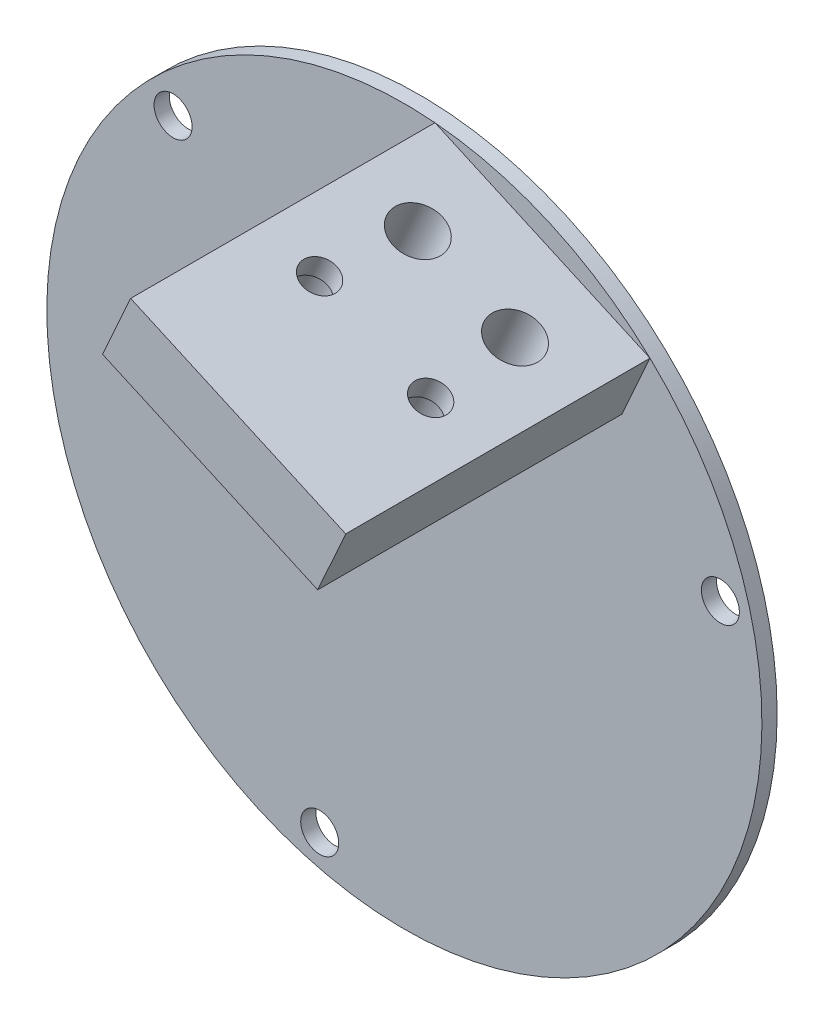
ISO-10303-21;
HEADER;
FILE_DESCRIPTION(('STEP AP214'),'2;1');
FILE_NAME('part.step','',(''),(''),'','','');
FILE_SCHEMA(('AUTOMOTIVE_DESIGN { 1 0 10303 214 1 1 1 1 }'));
ENDSEC;
DATA;
#1=APPLICATION_CONTEXT('core data for automotive mechanical design processes');
#2=APPLICATION_PROTOCOL_DEFINITION('international standard','automotive_design',2000,#1);
#3=PRODUCT_CONTEXT('',#1,'mechanical');
#4=PRODUCT('Part','Part','',(#3));
#5=PRODUCT_RELATED_PRODUCT_CATEGORY('part','',(#4));
#6=PRODUCT_DEFINITION_FORMATION('','',#4);
#7=PRODUCT_DEFINITION_CONTEXT('part definition',#1,'design');
#8=PRODUCT_DEFINITION('design','',#6,#7);
#9=PRODUCT_DEFINITION_SHAPE('','',#8);
#10=(LENGTH_UNIT() NAMED_UNIT(*) SI_UNIT(.MILLI.,.METRE.));
#11=(NAMED_UNIT(*) PLANE_ANGLE_UNIT() SI_UNIT($,.RADIAN.));
#12=(NAMED_UNIT(*) SI_UNIT($,.STERADIAN.) SOLID_ANGLE_UNIT());
#13=UNCERTAINTY_MEASURE_WITH_UNIT(LENGTH_MEASURE(1.E-05),#10,'distance_accuracy_value','');
#14=(GEOMETRIC_REPRESENTATION_CONTEXT(3) GLOBAL_UNCERTAINTY_ASSIGNED_CONTEXT((#13)) GLOBAL_UNIT_ASSIGNED_CONTEXT((#10,
#11,#12)) REPRESENTATION_CONTEXT('',''));
#15=CARTESIAN_POINT('',(0.,0.,0.));
#16=DIRECTION('',(0.,0.,1.));
#17=DIRECTION('',(1.,0.,0.));
#18=AXIS2_PLACEMENT_3D('',#15,#16,#17);
#19=CARTESIAN_POINT('',(-32.7129278254319,-53.4071924657605,24.));
#20=DIRECTION('',(0.409119428181415,0.912480845543901,0.));
#21=DIRECTION('',(-0.912480845543901,0.409119428181415,0.));
#22=AXIS2_PLACEMENT_3D('',#19,#20,#21);
#23=CYLINDRICAL_SURFACE('',#22,2.25);
#24=CARTESIAN_POINT('',(10.854593128497,43.7637694096174,24.));
#25=DIRECTION('',(0.409119428181415,0.912480845543901,0.));
#26=DIRECTION('',(0.912480845543901,-0.409119428181415,0.));
#27=AXIS2_PLACEMENT_3D('',#24,#25,#26);
#28=CIRCLE('',#27,2.25);
#29=CARTESIAN_POINT('',(12.9076750309708,42.8432506962092,24.));
#30=VERTEX_POINT('',#29);
#31=EDGE_CURVE('E254',#30,#30,#28,.T.);
#32=ORIENTED_EDGE('',*,*,#31,.T.);
#33=EDGE_LOOP('',(#32));
#34=FACE_BOUND('',#33,.T.);
#35=CARTESIAN_POINT('',(9.62723484395276,41.0263268729857,24.));
#36=DIRECTION('',(-0.409119428181415,-0.912480845543901,0.));
#37=DIRECTION('',(0.912480845543901,-0.409119428181415,0.));
#38=AXIS2_PLACEMENT_3D('',#35,#36,#37);
#39=CIRCLE('',#38,2.25);
#40=CARTESIAN_POINT('',(11.6803167464265,40.1058081595775,24.));
#41=VERTEX_POINT('',#40);
#42=EDGE_CURVE('E170',#41,#41,#39,.F.);
#43=ORIENTED_EDGE('',*,*,#42,.F.);
#44=EDGE_LOOP('',(#43));
#45=FACE_BOUND('',#44,.T.);
#46=ADVANCED_FACE('F35',(#34,#45),#23,.F.);
#47=CARTESIAN_POINT('',(-31.800446979888,-53.8163118939419,12.));
#48=DIRECTION('',(0.409119428181415,0.912480845543901,0.));
#49=DIRECTION('',(-0.912480845543901,0.409119428181415,0.));
#50=AXIS2_PLACEMENT_3D('',#47,#48,#49);
#51=CYLINDRICAL_SURFACE('',#50,3.24999999999996);
#52=CARTESIAN_POINT('',(11.7670739740409,43.354649981436,12.));
#53=DIRECTION('',(0.409119428181415,0.912480845543901,0.));
#54=DIRECTION('',(0.912480845543901,-0.409119428181415,0.));
#55=AXIS2_PLACEMENT_3D('',#52,#53,#54);
#56=CIRCLE('',#55,3.24999999999996);
#57=CARTESIAN_POINT('',(14.7326367220585,42.0250118398464,12.));
#58=VERTEX_POINT('',#57);
#59=EDGE_CURVE('E257',#58,#58,#56,.T.);
#60=ORIENTED_EDGE('',*,*,#59,.T.);
#61=EDGE_LOOP('',(#60));
#62=FACE_BOUND('',#61,.T.);
#63=CARTESIAN_POINT('',(8.49411854858957,36.0548032170847,12.));
#64=DIRECTION('',(-0.409119428181415,-0.912480845543901,0.));
#65=DIRECTION('',(0.912480845543901,-0.409119428181415,0.));
#66=AXIS2_PLACEMENT_3D('',#63,#64,#65);
#67=CIRCLE('',#66,3.24999999999996);
#68=CARTESIAN_POINT('',(11.4596812966072,34.7251650754952,12.));
#69=VERTEX_POINT('',#68);
#70=EDGE_CURVE('E212',#69,#69,#67,.F.);
#71=ORIENTED_EDGE('',*,*,#70,.F.);
#72=EDGE_LOOP('',(#71));
#73=FACE_BOUND('',#72,.T.);
#74=ADVANCED_FACE('F341',(#62,#73),#51,.F.);
#75=CARTESIAN_POINT('',(0.,0.,2.));
#76=DIRECTION('',(0.,0.,1.));
#77=DIRECTION('',(1.,0.,0.));
#78=AXIS2_PLACEMENT_3D('',#75,#76,#77);
#79=PLANE('',#78);
#80=DIRECTION('',(0.409119428181418,0.9124808455439,0.));
#81=VECTOR('',#80,1.);
#82=CARTESIAN_POINT('',(32.2878902927665,34.1539476553191,2.));
#83=LINE('',#82,#81);
#84=CARTESIAN_POINT('',(28.6058154391337,25.941620045424,2.));
#85=VERTEX_POINT('',#84);
#86=CARTESIAN_POINT('',(32.2878902927665,34.1539476553191,2.));
#87=VERTEX_POINT('',#86);
#88=EDGE_CURVE('E263',#85,#87,#83,.T.);
#89=ORIENTED_EDGE('',*,*,#88,.F.);
#90=DIRECTION('',(0.912480845543901,-0.409119428181415,0.));
#91=VECTOR('',#90,1.);
#92=CARTESIAN_POINT('',(28.6058154391337,25.941620045424,2.));
#93=LINE('',#92,#91);
#94=CARTESIAN_POINT('',(0.338914639297202,38.6153527031179,2.));
#95=VERTEX_POINT('',#94);
#96=EDGE_CURVE('E268',#95,#85,#93,.T.);
#97=ORIENTED_EDGE('',*,*,#96,.F.);
#98=DIRECTION('',(-0.409119428181415,-0.912480845543901,0.));
#99=VECTOR('',#98,1.);
#100=CARTESIAN_POINT('',(0.338914639297202,38.6153527031179,2.));
#101=LINE('',#100,#99);
#102=CARTESIAN_POINT('',(4.02098949292994,46.827680313013,2.));
#103=VERTEX_POINT('',#102);
#104=EDGE_CURVE('E280',#103,#95,#101,.T.);
#105=ORIENTED_EDGE('',*,*,#104,.F.);
#106=CARTESIAN_POINT('',(0.,0.,2.));
#107=DIRECTION('',(0.,0.,1.));
#108=DIRECTION('',(1.,0.,0.));
#109=AXIS2_PLACEMENT_3D('',#106,#107,#108);
#110=CIRCLE('',#109,47.);
#111=EDGE_CURVE('E44',#103,#87,#110,.T.);
#112=ORIENTED_EDGE('',*,*,#111,.T.);
#113=EDGE_LOOP('',(#89,#97,#105,#112));
#114=FACE_BOUND('',#113,.T.);
#115=CARTESIAN_POINT('',(41.5348105304283,11.1292189394104,2.));
#116=DIRECTION('',(0.,0.,-1.));
#117=DIRECTION('',(-1.,0.,0.));
#118=AXIS2_PLACEMENT_3D('',#115,#116,#117);
#119=CIRCLE('',#118,2.5);
#120=CARTESIAN_POINT('',(39.0348105304283,11.1292189394104,2.));
#121=VERTEX_POINT('',#120);
#122=EDGE_CURVE('E297',#121,#121,#119,.T.);
#123=ORIENTED_EDGE('',*,*,#122,.T.);
#124=EDGE_LOOP('',(#123));
#125=FACE_BOUND('',#124,.T.);
#126=CARTESIAN_POINT('',(-30.4055915910216,30.4055915910215,2.));
#127=DIRECTION('',(0.,0.,-1.));
#128=DIRECTION('',(-1.,0.,0.));
#129=AXIS2_PLACEMENT_3D('',#126,#127,#128);
#130=CIRCLE('',#129,2.5);
#131=CARTESIAN_POINT('',(-32.9055915910216,30.4055915910215,2.));
#132=VERTEX_POINT('',#131);
#133=EDGE_CURVE('E307',#132,#132,#130,.T.);
#134=ORIENTED_EDGE('',*,*,#133,.T.);
#135=EDGE_LOOP('',(#134));
#136=FACE_BOUND('',#135,.T.);
#137=CARTESIAN_POINT('',(-11.1292189394084,-41.534810530431,2.));
#138=DIRECTION('',(0.,0.,-1.));
#139=DIRECTION('',(-1.,0.,0.));
#140=AXIS2_PLACEMENT_3D('',#137,#138,#139);
#141=CIRCLE('',#140,2.5);
#142=CARTESIAN_POINT('',(-13.6292189394084,-41.534810530431,2.));
#143=VERTEX_POINT('',#142);
#144=EDGE_CURVE('E296',#143,#143,#141,.T.);
#145=ORIENTED_EDGE('',*,*,#144,.T.);
#146=EDGE_LOOP('',(#145));
#147=FACE_BOUND('',#146,.T.);
#148=ADVANCED_FACE('F347',(#114,#125,#136,#147),#79,.T.);
#149=CARTESIAN_POINT('',(0.,0.,2.));
#150=DIRECTION('',(0.,0.,-1.));
#151=DIRECTION('',(-1.,0.,0.));
#152=AXIS2_PLACEMENT_3D('',#149,#150,#151);
#153=CYLINDRICAL_SURFACE('',#152,47.);
#154=EDGE_CURVE('E11',#87,#103,#110,.T.);
#155=ORIENTED_EDGE('',*,*,#154,.F.);
#156=ORIENTED_EDGE('',*,*,#111,.F.);
#157=EDGE_LOOP('',(#155,#156));
#158=FACE_BOUND('',#157,.T.);
#159=CARTESIAN_POINT('',(0.,0.,0.));
#160=DIRECTION('',(0.,0.,1.));
#161=DIRECTION('',(1.,0.,0.));
#162=AXIS2_PLACEMENT_3D('',#159,#160,#161);
#163=CIRCLE('',#162,47.);
#164=CARTESIAN_POINT('',(47.,0.,0.));
#165=VERTEX_POINT('',#164);
#166=EDGE_CURVE('E300',#165,#165,#163,.T.);
#167=ORIENTED_EDGE('',*,*,#166,.T.);
#168=EDGE_LOOP('',(#167));
#169=FACE_BOUND('',#168,.T.);
#170=ADVANCED_FACE('F37',(#158,#169),#153,.T.);
#171=DIRECTION('',(-0.912480845543901,0.409119428181415,0.));
#172=VECTOR('',#171,1.);
#173=CARTESIAN_POINT('',(4.02098949292994,46.827680313013,2.));
#174=LINE('',#173,#172);
#175=EDGE_CURVE('E277',#87,#103,#174,.T.);
#176=ORIENTED_EDGE('',*,*,#175,.F.);
#177=ORIENTED_EDGE('',*,*,#154,.T.);
#178=EDGE_LOOP('',(#176,#177));
#179=FACE_BOUND('',#178,.T.);
#180=ADVANCED_FACE('F391',(#179),#79,.T.);
#181=CARTESIAN_POINT('',(0.,0.,0.));
#182=DIRECTION('',(0.,0.,1.));
#183=DIRECTION('',(1.,0.,0.));
#184=AXIS2_PLACEMENT_3D('',#181,#182,#183);
#185=PLANE('',#184);
#186=CARTESIAN_POINT('',(41.5348105304283,11.1292189394104,0.));
#187=DIRECTION('',(0.,0.,-1.));
#188=DIRECTION('',(-1.,0.,0.));
#189=AXIS2_PLACEMENT_3D('',#186,#187,#188);
#190=CIRCLE('',#189,2.5);
#191=CARTESIAN_POINT('',(39.0348105304283,11.1292189394104,0.));
#192=VERTEX_POINT('',#191);
#193=EDGE_CURVE('E301',#192,#192,#190,.T.);
#194=ORIENTED_EDGE('',*,*,#193,.F.);
#195=EDGE_LOOP('',(#194));
#196=FACE_BOUND('',#195,.T.);
#197=CARTESIAN_POINT('',(-30.4055915910216,30.4055915910215,0.));
#198=DIRECTION('',(0.,0.,-1.));
#199=DIRECTION('',(-1.,0.,0.));
#200=AXIS2_PLACEMENT_3D('',#197,#198,#199);
#201=CIRCLE('',#200,2.5);
#202=CARTESIAN_POINT('',(-32.9055915910216,30.4055915910215,0.));
#203=VERTEX_POINT('',#202);
#204=EDGE_CURVE('E304',#203,#203,#201,.T.);
#205=ORIENTED_EDGE('',*,*,#204,.F.);
#206=EDGE_LOOP('',(#205));
#207=FACE_BOUND('',#206,.T.);
#208=CARTESIAN_POINT('',(-11.1292189394084,-41.534810530431,0.));
#209=DIRECTION('',(0.,0.,-1.));
#210=DIRECTION('',(-1.,0.,0.));
#211=AXIS2_PLACEMENT_3D('',#208,#209,#210);
#212=CIRCLE('',#211,2.5);
#213=CARTESIAN_POINT('',(-13.6292189394084,-41.534810530431,0.));
#214=VERTEX_POINT('',#213);
#215=EDGE_CURVE('E310',#214,#214,#212,.T.);
#216=ORIENTED_EDGE('',*,*,#215,.F.);
#217=EDGE_LOOP('',(#216));
#218=FACE_BOUND('',#217,.T.);
#219=ORIENTED_EDGE('',*,*,#166,.F.);
#220=EDGE_LOOP('',(#219));
#221=FACE_BOUND('',#220,.T.);
#222=ADVANCED_FACE('F389',(#196,#207,#218,#221),#185,.F.);
#223=CARTESIAN_POINT('',(-11.1292189394084,-41.534810530431,2.));
#224=DIRECTION('',(0.,0.,-1.));
#225=DIRECTION('',(-1.,0.,0.));
#226=AXIS2_PLACEMENT_3D('',#223,#224,#225);
#227=CYLINDRICAL_SURFACE('',#226,2.5);
#228=ORIENTED_EDGE('',*,*,#144,.F.);
#229=EDGE_LOOP('',(#228));
#230=FACE_BOUND('',#229,.T.);
#231=ORIENTED_EDGE('',*,*,#215,.T.);
#232=EDGE_LOOP('',(#231));
#233=FACE_BOUND('',#232,.T.);
#234=ADVANCED_FACE('F385',(#230,#233),#227,.F.);
#235=CARTESIAN_POINT('',(-30.4055915910216,30.4055915910215,2.));
#236=DIRECTION('',(0.,0.,-1.));
#237=DIRECTION('',(-1.,0.,0.));
#238=AXIS2_PLACEMENT_3D('',#235,#236,#237);
#239=CYLINDRICAL_SURFACE('',#238,2.5);
#240=ORIENTED_EDGE('',*,*,#133,.F.);
#241=EDGE_LOOP('',(#240));
#242=FACE_BOUND('',#241,.T.);
#243=ORIENTED_EDGE('',*,*,#204,.T.);
#244=EDGE_LOOP('',(#243));
#245=FACE_BOUND('',#244,.T.);
#246=ADVANCED_FACE('F381',(#242,#245),#239,.F.);
#247=CARTESIAN_POINT('',(41.5348105304283,11.1292189394104,2.));
#248=DIRECTION('',(0.,0.,-1.));
#249=DIRECTION('',(-1.,0.,0.));
#250=AXIS2_PLACEMENT_3D('',#247,#248,#249);
#251=CYLINDRICAL_SURFACE('',#250,2.5);
#252=ORIENTED_EDGE('',*,*,#122,.F.);
#253=EDGE_LOOP('',(#252));
#254=FACE_BOUND('',#253,.T.);
#255=ORIENTED_EDGE('',*,*,#193,.T.);
#256=EDGE_LOOP('',(#255));
#257=FACE_BOUND('',#256,.T.);
#258=ADVANCED_FACE('F377',(#254,#257),#251,.F.);
#259=CARTESIAN_POINT('',(32.2878902927665,34.1539476553191,42.));
#260=DIRECTION('',(-0.9124808455439,0.409119428181418,0.));
#261=DIRECTION('',(-0.409119428181418,-0.9124808455439,0.));
#262=AXIS2_PLACEMENT_3D('',#259,#260,#261);
#263=PLANE('',#262);
#264=ORIENTED_EDGE('',*,*,#88,.T.);
#265=DIRECTION('',(0.,0.,-1.));
#266=VECTOR('',#265,1.);
#267=CARTESIAN_POINT('',(32.2878902927665,34.1539476553191,42.));
#268=LINE('',#267,#266);
#269=CARTESIAN_POINT('',(32.2878902927665,34.1539476553191,42.));
#270=VERTEX_POINT('',#269);
#271=EDGE_CURVE('E293',#270,#87,#268,.T.);
#272=ORIENTED_EDGE('',*,*,#271,.F.);
#273=DIRECTION('',(0.409119428181418,0.9124808455439,0.));
#274=VECTOR('',#273,1.);
#275=CARTESIAN_POINT('',(32.2878902927665,34.1539476553191,42.));
#276=LINE('',#275,#274);
#277=CARTESIAN_POINT('',(28.6058154391337,25.941620045424,42.));
#278=VERTEX_POINT('',#277);
#279=EDGE_CURVE('E264',#278,#270,#276,.T.);
#280=ORIENTED_EDGE('',*,*,#279,.F.);
#281=DIRECTION('',(0.,0.,-1.));
#282=VECTOR('',#281,1.);
#283=CARTESIAN_POINT('',(28.6058154391337,25.941620045424,42.));
#284=LINE('',#283,#282);
#285=EDGE_CURVE('E274',#278,#85,#284,.T.);
#286=ORIENTED_EDGE('',*,*,#285,.T.);
#287=EDGE_LOOP('',(#264,#272,#280,#286));
#288=FACE_BOUND('',#287,.T.);
#289=ADVANCED_FACE('F373',(#288),#263,.F.);
#290=CARTESIAN_POINT('',(4.02098949292994,46.827680313013,42.));
#291=DIRECTION('',(-0.409119428181415,-0.912480845543901,0.));
#292=DIRECTION('',(0.912480845543901,-0.409119428181415,0.));
#293=AXIS2_PLACEMENT_3D('',#290,#291,#292);
#294=PLANE('',#293);
#295=ORIENTED_EDGE('',*,*,#59,.F.);
#296=EDGE_LOOP('',(#295));
#297=FACE_BOUND('',#296,.T.);
#298=ORIENTED_EDGE('',*,*,#31,.F.);
#299=EDGE_LOOP('',(#298));
#300=FACE_BOUND('',#299,.T.);
#301=CARTESIAN_POINT('',(25.4542866571994,37.2178585587148,24.));
#302=DIRECTION('',(0.409119428181415,0.912480845543901,0.));
#303=DIRECTION('',(-0.912480845543901,0.409119428181415,0.));
#304=AXIS2_PLACEMENT_3D('',#301,#302,#303);
#305=CIRCLE('',#304,2.25);
#306=CARTESIAN_POINT('',(23.4012047547256,38.1383772721229,24.));
#307=VERTEX_POINT('',#306);
#308=EDGE_CURVE('E250',#307,#307,#305,.T.);
#309=ORIENTED_EDGE('',*,*,#308,.F.);
#310=EDGE_LOOP('',(#309));
#311=FACE_BOUND('',#310,.T.);
#312=CARTESIAN_POINT('',(24.5418058116555,37.6269779868962,12.));
#313=DIRECTION('',(0.409119428181415,0.912480845543901,0.));
#314=DIRECTION('',(-0.912480845543901,0.409119428181415,0.));
#315=AXIS2_PLACEMENT_3D('',#312,#313,#314);
#316=CIRCLE('',#315,3.25);
#317=CARTESIAN_POINT('',(21.5762430636378,38.9566161284858,12.));
#318=VERTEX_POINT('',#317);
#319=EDGE_CURVE('E253',#318,#318,#316,.T.);
#320=ORIENTED_EDGE('',*,*,#319,.F.);
#321=EDGE_LOOP('',(#320));
#322=FACE_BOUND('',#321,.T.);
#323=ORIENTED_EDGE('',*,*,#175,.T.);
#324=DIRECTION('',(0.,0.,-1.));
#325=VECTOR('',#324,1.);
#326=CARTESIAN_POINT('',(4.02098949292994,46.827680313013,42.));
#327=LINE('',#326,#325);
#328=CARTESIAN_POINT('',(4.02098949292994,46.827680313013,42.));
#329=VERTEX_POINT('',#328);
#330=EDGE_CURVE('E290',#329,#103,#327,.T.);
#331=ORIENTED_EDGE('',*,*,#330,.F.);
#332=DIRECTION('',(-0.912480845543901,0.409119428181415,0.));
#333=VECTOR('',#332,1.);
#334=CARTESIAN_POINT('',(4.02098949292994,46.827680313013,42.));
#335=LINE('',#334,#333);
#336=EDGE_CURVE('E267',#270,#329,#335,.T.);
#337=ORIENTED_EDGE('',*,*,#336,.F.);
#338=ORIENTED_EDGE('',*,*,#271,.T.);
#339=EDGE_LOOP('',(#323,#331,#337,#338));
#340=FACE_BOUND('',#339,.T.);
#341=ADVANCED_FACE('F369',(#297,#300,#311,#322,#340),#294,.F.);
#342=CARTESIAN_POINT('',(0.338914639297202,38.6153527031179,42.));
#343=DIRECTION('',(0.912480845543901,-0.409119428181415,0.));
#344=DIRECTION('',(0.409119428181415,0.912480845543901,0.));
#345=AXIS2_PLACEMENT_3D('',#342,#343,#344);
#346=PLANE('',#345);
#347=ORIENTED_EDGE('',*,*,#104,.T.);
#348=DIRECTION('',(0.,0.,-1.));
#349=VECTOR('',#348,1.);
#350=CARTESIAN_POINT('',(0.338914639297202,38.6153527031179,42.));
#351=LINE('',#350,#349);
#352=CARTESIAN_POINT('',(0.338914639297202,38.6153527031179,42.));
#353=VERTEX_POINT('',#352);
#354=EDGE_CURVE('E287',#353,#95,#351,.T.);
#355=ORIENTED_EDGE('',*,*,#354,.F.);
#356=DIRECTION('',(-0.409119428181415,-0.912480845543901,0.));
#357=VECTOR('',#356,1.);
#358=CARTESIAN_POINT('',(0.338914639297202,38.6153527031179,42.));
#359=LINE('',#358,#357);
#360=EDGE_CURVE('E270',#329,#353,#359,.T.);
#361=ORIENTED_EDGE('',*,*,#360,.F.);
#362=ORIENTED_EDGE('',*,*,#330,.T.);
#363=EDGE_LOOP('',(#347,#355,#361,#362));
#364=FACE_BOUND('',#363,.T.);
#365=ADVANCED_FACE('F365',(#364),#346,.F.);
#366=CARTESIAN_POINT('',(28.6058154391337,25.941620045424,42.));
#367=DIRECTION('',(0.409119428181415,0.912480845543901,0.));
#368=DIRECTION('',(-0.912480845543901,0.409119428181415,0.));
#369=AXIS2_PLACEMENT_3D('',#366,#367,#368);
#370=PLANE('',#369);
#371=DIRECTION('',(0.,0.,-1.));
#372=VECTOR('',#371,1.);
#373=CARTESIAN_POINT('',(19.262889478321,30.1306093763185,25.1989578808282));
#374=LINE('',#373,#372);
#375=CARTESIAN_POINT('',(19.2628894783209,30.1306093763185,25.1989578808282));
#376=VERTEX_POINT('',#375);
#377=CARTESIAN_POINT('',(19.262889478321,30.1306093763185,22.8010421191718));
#378=VERTEX_POINT('',#377);
#379=EDGE_CURVE('E162',#376,#378,#374,.T.);
#380=ORIENTED_EDGE('',*,*,#379,.F.);
#381=CARTESIAN_POINT('',(21.7722118035667,29.0055309488196,24.));
#382=DIRECTION('',(-0.409119428181415,-0.912480845543901,0.));
#383=DIRECTION('',(-0.912480845543901,0.409119428181415,0.));
#384=AXIS2_PLACEMENT_3D('',#381,#382,#383);
#385=CIRCLE('',#384,3.);
#386=EDGE_CURVE('E52',#378,#376,#385,.T.);
#387=ORIENTED_EDGE('',*,*,#386,.F.);
#388=EDGE_LOOP('',(#380,#387));
#389=FACE_BOUND('',#388,.T.);
#390=DIRECTION('',(0.,0.,1.));
#391=VECTOR('',#390,1.);
#392=CARTESIAN_POINT('',(9.68184060011,34.4263633722234,25.1989578808282));
#393=LINE('',#392,#391);
#394=CARTESIAN_POINT('',(9.68184060010999,34.4263633722234,22.8010421191718));
#395=VERTEX_POINT('',#394);
#396=CARTESIAN_POINT('',(9.68184060011,34.4263633722234,25.1989578808282));
#397=VERTEX_POINT('',#396);
#398=EDGE_CURVE('E176',#395,#397,#393,.T.);
#399=ORIENTED_EDGE('',*,*,#398,.F.);
#400=CARTESIAN_POINT('',(7.17251827486427,35.5514417997223,24.));
#401=DIRECTION('',(-0.409119428181415,-0.912480845543901,0.));
#402=DIRECTION('',(0.912480845543901,-0.409119428181415,0.));
#403=AXIS2_PLACEMENT_3D('',#400,#401,#402);
#404=CIRCLE('',#403,3.);
#405=EDGE_CURVE('E60',#397,#395,#404,.T.);
#406=ORIENTED_EDGE('',*,*,#405,.F.);
#407=EDGE_LOOP('',(#399,#406));
#408=FACE_BOUND('',#407,.T.);
#409=DIRECTION('',(-0.912480845543901,0.409119428181415,0.));
#410=VECTOR('',#409,1.);
#411=CARTESIAN_POINT('',(15.8410863075313,31.6648072319988,18.5));
#412=LINE('',#411,#410);
#413=CARTESIAN_POINT('',(25.8783756085142,27.1644935220033,18.5));
#414=VERTEX_POINT('',#413);
#415=CARTESIAN_POINT('',(15.8410863075313,31.6648072319988,18.5));
#416=VERTEX_POINT('',#415);
#417=EDGE_CURVE('E201',#414,#416,#412,.T.);
#418=ORIENTED_EDGE('',*,*,#417,.F.);
#419=DIRECTION('',(0.,0.,1.));
#420=VECTOR('',#419,1.);
#421=CARTESIAN_POINT('',(25.8783756085142,27.1644935220033,5.5));
#422=LINE('',#421,#420);
#423=CARTESIAN_POINT('',(25.8783756085142,27.1644935220033,5.5));
#424=VERTEX_POINT('',#423);
#425=EDGE_CURVE('E199',#424,#414,#422,.T.);
#426=ORIENTED_EDGE('',*,*,#425,.F.);
#427=DIRECTION('',(0.912480845543901,-0.409119428181415,0.));
#428=VECTOR('',#427,1.);
#429=CARTESIAN_POINT('',(15.8410863075313,31.6648072319988,5.5));
#430=LINE('',#429,#428);
#431=CARTESIAN_POINT('',(15.8410863075313,31.6648072319988,5.5));
#432=VERTEX_POINT('',#431);
#433=EDGE_CURVE('E189',#432,#424,#430,.T.);
#434=ORIENTED_EDGE('',*,*,#433,.F.);
#435=DIRECTION('',(0.,0.,-1.));
#436=VECTOR('',#435,1.);
#437=CARTESIAN_POINT('',(15.8410863075313,31.6648072319988,5.5));
#438=LINE('',#437,#436);
#439=EDGE_CURVE('E205',#416,#432,#438,.T.);
#440=ORIENTED_EDGE('',*,*,#439,.F.);
#441=EDGE_LOOP('',(#418,#426,#434,#440));
#442=FACE_BOUND('',#441,.T.);
#443=DIRECTION('',(-0.912480845543901,0.409119428181415,0.));
#444=VECTOR('',#443,1.);
#445=CARTESIAN_POINT('',(13.1036437708996,32.8921655165431,18.5));
#446=LINE('',#445,#444);
#447=CARTESIAN_POINT('',(13.1036437708996,32.8921655165431,18.5));
#448=VERTEX_POINT('',#447);
#449=CARTESIAN_POINT('',(3.06635446991674,37.3924792265386,18.5));
#450=VERTEX_POINT('',#449);
#451=EDGE_CURVE('E235',#448,#450,#446,.T.);
#452=ORIENTED_EDGE('',*,*,#451,.F.);
#453=DIRECTION('',(0.,0.,1.));
#454=VECTOR('',#453,1.);
#455=CARTESIAN_POINT('',(13.1036437708996,32.8921655165431,5.5));
#456=LINE('',#455,#454);
#457=CARTESIAN_POINT('',(13.1036437708996,32.8921655165431,5.5));
#458=VERTEX_POINT('',#457);
#459=EDGE_CURVE('E233',#458,#448,#456,.T.);
#460=ORIENTED_EDGE('',*,*,#459,.F.);
#461=DIRECTION('',(0.912480845543901,-0.409119428181415,0.));
#462=VECTOR('',#461,1.);
#463=CARTESIAN_POINT('',(13.1036437708996,32.8921655165431,5.5));
#464=LINE('',#463,#462);
#465=CARTESIAN_POINT('',(3.06635446991674,37.3924792265386,5.5));
#466=VERTEX_POINT('',#465);
#467=EDGE_CURVE('E223',#466,#458,#464,.T.);
#468=ORIENTED_EDGE('',*,*,#467,.F.);
#469=DIRECTION('',(0.,0.,-1.));
#470=VECTOR('',#469,1.);
#471=CARTESIAN_POINT('',(3.06635446991674,37.3924792265386,5.5));
#472=LINE('',#471,#470);
#473=EDGE_CURVE('E238',#450,#466,#472,.T.);
#474=ORIENTED_EDGE('',*,*,#473,.F.);
#475=EDGE_LOOP('',(#452,#460,#468,#474));
#476=FACE_BOUND('',#475,.T.);
#477=ORIENTED_EDGE('',*,*,#96,.T.);
#478=ORIENTED_EDGE('',*,*,#285,.F.);
#479=DIRECTION('',(0.912480845543901,-0.409119428181415,0.));
#480=VECTOR('',#479,1.);
#481=CARTESIAN_POINT('',(28.6058154391337,25.941620045424,42.));
#482=LINE('',#481,#480);
#483=EDGE_CURVE('E272',#353,#278,#482,.T.);
#484=ORIENTED_EDGE('',*,*,#483,.F.);
#485=ORIENTED_EDGE('',*,*,#354,.T.);
#486=EDGE_LOOP('',(#477,#478,#484,#485));
#487=FACE_BOUND('',#486,.T.);
#488=ADVANCED_FACE('F361',(#389,#408,#442,#476,#487),#370,.F.);
#489=CARTESIAN_POINT('',(0.,0.,42.));
#490=DIRECTION('',(0.,0.,-1.));
#491=DIRECTION('',(-1.,0.,0.));
#492=AXIS2_PLACEMENT_3D('',#489,#490,#491);
#493=PLANE('',#492);
#494=ORIENTED_EDGE('',*,*,#279,.T.);
#495=ORIENTED_EDGE('',*,*,#336,.T.);
#496=ORIENTED_EDGE('',*,*,#360,.T.);
#497=ORIENTED_EDGE('',*,*,#483,.T.);
#498=EDGE_LOOP('',(#494,#495,#496,#497));
#499=FACE_BOUND('',#498,.T.);
#500=ADVANCED_FACE('F357',(#499),#493,.F.);
#501=CARTESIAN_POINT('',(-19.0257151422734,-59.5439838884817,12.));
#502=DIRECTION('',(0.409119428181415,0.912480845543901,0.));
#503=DIRECTION('',(-0.912480845543901,0.409119428181415,0.));
#504=AXIS2_PLACEMENT_3D('',#501,#502,#503);
#505=CYLINDRICAL_SURFACE('',#504,3.25);
#506=CARTESIAN_POINT('',(21.2688503862042,30.327131222545,12.));
#507=DIRECTION('',(0.409119428181415,0.912480845543901,0.));
#508=DIRECTION('',(-0.912480845543901,0.409119428181415,0.));
#509=AXIS2_PLACEMENT_3D('',#506,#507,#508);
#510=CIRCLE('',#509,3.25);
#511=CARTESIAN_POINT('',(18.3032876381865,31.6567693641346,12.));
#512=VERTEX_POINT('',#511);
#513=EDGE_CURVE('E260',#512,#512,#510,.F.);
#514=ORIENTED_EDGE('',*,*,#513,.T.);
#515=EDGE_LOOP('',(#514));
#516=FACE_BOUND('',#515,.T.);
#517=ORIENTED_EDGE('',*,*,#319,.T.);
#518=EDGE_LOOP('',(#517));
#519=FACE_BOUND('',#518,.T.);
#520=ADVANCED_FACE('F354',(#516,#519),#505,.F.);
#521=CARTESIAN_POINT('',(-18.1132342967295,-59.9531033166631,24.));
#522=DIRECTION('',(0.409119428181415,0.912480845543901,0.));
#523=DIRECTION('',(-0.912480845543901,0.409119428181415,0.));
#524=AXIS2_PLACEMENT_3D('',#521,#522,#523);
#525=CYLINDRICAL_SURFACE('',#524,2.25);
#526=CARTESIAN_POINT('',(24.2269283726552,34.480416022083,24.));
#527=DIRECTION('',(0.409119428181415,0.912480845543901,0.));
#528=DIRECTION('',(-0.912480845543901,0.409119428181415,0.));
#529=AXIS2_PLACEMENT_3D('',#526,#527,#528);
#530=CIRCLE('',#529,2.25);
#531=CARTESIAN_POINT('',(22.1738464701814,35.4009347354912,24.));
#532=VERTEX_POINT('',#531);
#533=EDGE_CURVE('E39',#532,#532,#530,.F.);
#534=ORIENTED_EDGE('',*,*,#533,.T.);
#535=EDGE_LOOP('',(#534));
#536=FACE_BOUND('',#535,.T.);
#537=ORIENTED_EDGE('',*,*,#308,.T.);
#538=EDGE_LOOP('',(#537));
#539=FACE_BOUND('',#538,.T.);
#540=ADVANCED_FACE('F326',(#536,#539),#525,.F.);
#541=CARTESIAN_POINT('',(14.8814844673969,33.1909672198149,0.));
#542=DIRECTION('',(-0.409119428181415,-0.912480845543901,0.));
#543=DIRECTION('',(0.912480845543901,-0.409119428181415,0.));
#544=AXIS2_PLACEMENT_3D('',#541,#542,#543);
#545=PLANE('',#544);
#546=DIRECTION('',(0.,0.,1.));
#547=VECTOR('',#546,1.);
#548=CARTESIAN_POINT('',(13.5127631990811,33.804646362087,5.5));
#549=LINE('',#548,#547);
#550=CARTESIAN_POINT('',(13.5127631990811,33.804646362087,5.5));
#551=VERTEX_POINT('',#550);
#552=CARTESIAN_POINT('',(13.5127631990811,33.804646362087,18.5));
#553=VERTEX_POINT('',#552);
#554=EDGE_CURVE('E219',#551,#553,#549,.T.);
#555=ORIENTED_EDGE('',*,*,#554,.T.);
#556=DIRECTION('',(-0.912480845543901,0.409119428181415,0.));
#557=VECTOR('',#556,1.);
#558=CARTESIAN_POINT('',(13.5127631990811,33.804646362087,18.5));
#559=LINE('',#558,#557);
#560=CARTESIAN_POINT('',(3.47547389809815,38.3049600720825,18.5));
#561=VERTEX_POINT('',#560);
#562=EDGE_CURVE('E222',#553,#561,#559,.T.);
#563=ORIENTED_EDGE('',*,*,#562,.T.);
#564=DIRECTION('',(0.,0.,-1.));
#565=VECTOR('',#564,1.);
#566=CARTESIAN_POINT('',(3.47547389809815,38.3049600720825,5.5));
#567=LINE('',#566,#565);
#568=CARTESIAN_POINT('',(3.47547389809815,38.3049600720825,5.5));
#569=VERTEX_POINT('',#568);
#570=EDGE_CURVE('E226',#561,#569,#567,.T.);
#571=ORIENTED_EDGE('',*,*,#570,.T.);
#572=DIRECTION('',(0.912480845543901,-0.409119428181415,0.));
#573=VECTOR('',#572,1.);
#574=CARTESIAN_POINT('',(13.5127631990811,33.804646362087,5.5));
#575=LINE('',#574,#573);
#576=EDGE_CURVE('E229',#569,#551,#575,.T.);
#577=ORIENTED_EDGE('',*,*,#576,.T.);
#578=EDGE_LOOP('',(#555,#563,#571,#577));
#579=FACE_BOUND('',#578,.T.);
#580=ORIENTED_EDGE('',*,*,#70,.T.);
#581=EDGE_LOOP('',(#580));
#582=FACE_BOUND('',#581,.T.);
#583=ADVANCED_FACE('F460',(#579,#582),#545,.T.);
#584=CARTESIAN_POINT('',(13.5127631990811,33.804646362087,5.5));
#585=DIRECTION('',(0.912480845543901,-0.409119428181415,0.));
#586=DIRECTION('',(0.409119428181415,0.912480845543901,0.));
#587=AXIS2_PLACEMENT_3D('',#584,#585,#586);
#588=PLANE('',#587);
#589=ORIENTED_EDGE('',*,*,#459,.T.);
#590=DIRECTION('',(-0.409119428181415,-0.912480845543901,0.));
#591=VECTOR('',#590,1.);
#592=CARTESIAN_POINT('',(13.5127631990811,33.804646362087,18.5));
#593=LINE('',#592,#591);
#594=EDGE_CURVE('E232',#553,#448,#593,.T.);
#595=ORIENTED_EDGE('',*,*,#594,.F.);
#596=ORIENTED_EDGE('',*,*,#554,.F.);
#597=DIRECTION('',(-0.409119428181415,-0.912480845543901,0.));
#598=VECTOR('',#597,1.);
#599=CARTESIAN_POINT('',(13.5127631990811,33.804646362087,5.5));
#600=LINE('',#599,#598);
#601=EDGE_CURVE('E202',#551,#458,#600,.T.);
#602=ORIENTED_EDGE('',*,*,#601,.T.);
#603=EDGE_LOOP('',(#589,#595,#596,#602));
#604=FACE_BOUND('',#603,.T.);
#605=ADVANCED_FACE('F464',(#604),#588,.F.);
#606=CARTESIAN_POINT('',(13.5127631990811,33.804646362087,5.5));
#607=DIRECTION('',(0.,0.,-1.));
#608=DIRECTION('',(-1.,0.,0.));
#609=AXIS2_PLACEMENT_3D('',#606,#607,#608);
#610=PLANE('',#609);
#611=ORIENTED_EDGE('',*,*,#467,.T.);
#612=ORIENTED_EDGE('',*,*,#601,.F.);
#613=ORIENTED_EDGE('',*,*,#576,.F.);
#614=DIRECTION('',(-0.409119428181415,-0.912480845543901,0.));
#615=VECTOR('',#614,1.);
#616=CARTESIAN_POINT('',(3.47547389809815,38.3049600720825,5.5));
#617=LINE('',#616,#615);
#618=EDGE_CURVE('E244',#569,#466,#617,.T.);
#619=ORIENTED_EDGE('',*,*,#618,.T.);
#620=EDGE_LOOP('',(#611,#612,#613,#619));
#621=FACE_BOUND('',#620,.T.);
#622=ADVANCED_FACE('F474',(#621),#610,.F.);
#623=CARTESIAN_POINT('',(3.47547389809815,38.3049600720825,5.5));
#624=DIRECTION('',(-0.912480845543901,0.409119428181415,0.));
#625=DIRECTION('',(-0.409119428181415,-0.912480845543901,0.));
#626=AXIS2_PLACEMENT_3D('',#623,#624,#625);
#627=PLANE('',#626);
#628=ORIENTED_EDGE('',*,*,#473,.T.);
#629=ORIENTED_EDGE('',*,*,#618,.F.);
#630=ORIENTED_EDGE('',*,*,#570,.F.);
#631=DIRECTION('',(-0.409119428181415,-0.912480845543901,0.));
#632=VECTOR('',#631,1.);
#633=CARTESIAN_POINT('',(3.47547389809815,38.3049600720825,18.5));
#634=LINE('',#633,#632);
#635=EDGE_CURVE('E246',#561,#450,#634,.T.);
#636=ORIENTED_EDGE('',*,*,#635,.T.);
#637=EDGE_LOOP('',(#628,#629,#630,#636));
#638=FACE_BOUND('',#637,.T.);
#639=ADVANCED_FACE('F483',(#638),#627,.F.);
#640=CARTESIAN_POINT('',(13.5127631990811,33.804646362087,18.5));
#641=DIRECTION('',(0.,0.,1.));
#642=DIRECTION('',(1.,0.,0.));
#643=AXIS2_PLACEMENT_3D('',#640,#641,#642);
#644=PLANE('',#643);
#645=ORIENTED_EDGE('',*,*,#451,.T.);
#646=ORIENTED_EDGE('',*,*,#635,.F.);
#647=ORIENTED_EDGE('',*,*,#562,.F.);
#648=ORIENTED_EDGE('',*,*,#594,.T.);
#649=EDGE_LOOP('',(#645,#646,#647,#648));
#650=FACE_BOUND('',#649,.T.);
#651=ADVANCED_FACE('F493',(#650),#644,.F.);
#652=CARTESIAN_POINT('',(14.8814844673969,33.1909672198149,0.));
#653=DIRECTION('',(0.409119428181415,0.912480845543901,0.));
#654=DIRECTION('',(-0.912480845543901,0.409119428181415,0.));
#655=AXIS2_PLACEMENT_3D('',#652,#653,#654);
#656=PLANE('',#655);
#657=DIRECTION('',(0.,0.,1.));
#658=VECTOR('',#657,1.);
#659=CARTESIAN_POINT('',(26.2874950366956,28.0769743675472,5.5));
#660=LINE('',#659,#658);
#661=CARTESIAN_POINT('',(26.2874950366956,28.0769743675472,5.5));
#662=VERTEX_POINT('',#661);
#663=CARTESIAN_POINT('',(26.2874950366956,28.0769743675472,18.5));
#664=VERTEX_POINT('',#663);
#665=EDGE_CURVE('E185',#662,#664,#660,.T.);
#666=ORIENTED_EDGE('',*,*,#665,.T.);
#667=DIRECTION('',(-0.912480845543901,0.409119428181415,0.));
#668=VECTOR('',#667,1.);
#669=CARTESIAN_POINT('',(16.2502057357127,32.5772880775427,18.5));
#670=LINE('',#669,#668);
#671=CARTESIAN_POINT('',(16.2502057357127,32.5772880775427,18.5));
#672=VERTEX_POINT('',#671);
#673=EDGE_CURVE('E188',#664,#672,#670,.T.);
#674=ORIENTED_EDGE('',*,*,#673,.T.);
#675=DIRECTION('',(0.,0.,-1.));
#676=VECTOR('',#675,1.);
#677=CARTESIAN_POINT('',(16.2502057357127,32.5772880775427,5.5));
#678=LINE('',#677,#676);
#679=CARTESIAN_POINT('',(16.2502057357127,32.5772880775427,5.5));
#680=VERTEX_POINT('',#679);
#681=EDGE_CURVE('E192',#672,#680,#678,.T.);
#682=ORIENTED_EDGE('',*,*,#681,.T.);
#683=DIRECTION('',(0.912480845543901,-0.409119428181415,0.));
#684=VECTOR('',#683,1.);
#685=CARTESIAN_POINT('',(16.2502057357127,32.5772880775427,5.5));
#686=LINE('',#685,#684);
#687=EDGE_CURVE('E195',#680,#662,#686,.T.);
#688=ORIENTED_EDGE('',*,*,#687,.T.);
#689=EDGE_LOOP('',(#666,#674,#682,#688));
#690=FACE_BOUND('',#689,.T.);
#691=ORIENTED_EDGE('',*,*,#513,.F.);
#692=EDGE_LOOP('',(#691));
#693=FACE_BOUND('',#692,.T.);
#694=ADVANCED_FACE('F503',(#690,#693),#656,.F.);
#695=CARTESIAN_POINT('',(26.2874950366956,28.0769743675472,5.5));
#696=DIRECTION('',(0.912480845543901,-0.409119428181415,0.));
#697=DIRECTION('',(0.409119428181415,0.912480845543901,0.));
#698=AXIS2_PLACEMENT_3D('',#695,#696,#697);
#699=PLANE('',#698);
#700=ORIENTED_EDGE('',*,*,#425,.T.);
#701=DIRECTION('',(-0.409119428181415,-0.912480845543901,0.));
#702=VECTOR('',#701,1.);
#703=CARTESIAN_POINT('',(26.2874950366956,28.0769743675472,18.5));
#704=LINE('',#703,#702);
#705=EDGE_CURVE('E198',#664,#414,#704,.T.);
#706=ORIENTED_EDGE('',*,*,#705,.F.);
#707=ORIENTED_EDGE('',*,*,#665,.F.);
#708=DIRECTION('',(-0.409119428181415,-0.912480845543901,0.));
#709=VECTOR('',#708,1.);
#710=CARTESIAN_POINT('',(26.2874950366956,28.0769743675472,5.5));
#711=LINE('',#710,#709);
#712=EDGE_CURVE('E210',#662,#424,#711,.T.);
#713=ORIENTED_EDGE('',*,*,#712,.T.);
#714=EDGE_LOOP('',(#700,#706,#707,#713));
#715=FACE_BOUND('',#714,.T.);
#716=ADVANCED_FACE('F513',(#715),#699,.F.);
#717=CARTESIAN_POINT('',(16.2502057357127,32.5772880775427,5.5));
#718=DIRECTION('',(0.,0.,-1.));
#719=DIRECTION('',(-1.,0.,0.));
#720=AXIS2_PLACEMENT_3D('',#717,#718,#719);
#721=PLANE('',#720);
#722=ORIENTED_EDGE('',*,*,#433,.T.);
#723=ORIENTED_EDGE('',*,*,#712,.F.);
#724=ORIENTED_EDGE('',*,*,#687,.F.);
#725=DIRECTION('',(-0.409119428181415,-0.912480845543901,0.));
#726=VECTOR('',#725,1.);
#727=CARTESIAN_POINT('',(16.2502057357127,32.5772880775427,5.5));
#728=LINE('',#727,#726);
#729=EDGE_CURVE('E213',#680,#432,#728,.T.);
#730=ORIENTED_EDGE('',*,*,#729,.T.);
#731=EDGE_LOOP('',(#722,#723,#724,#730));
#732=FACE_BOUND('',#731,.T.);
#733=ADVANCED_FACE('F523',(#732),#721,.F.);
#734=CARTESIAN_POINT('',(16.2502057357127,32.5772880775427,5.5));
#735=DIRECTION('',(-0.912480845543901,0.409119428181415,0.));
#736=DIRECTION('',(-0.409119428181415,-0.912480845543901,0.));
#737=AXIS2_PLACEMENT_3D('',#734,#735,#736);
#738=PLANE('',#737);
#739=ORIENTED_EDGE('',*,*,#439,.T.);
#740=ORIENTED_EDGE('',*,*,#729,.F.);
#741=ORIENTED_EDGE('',*,*,#681,.F.);
#742=DIRECTION('',(-0.409119428181415,-0.912480845543901,0.));
#743=VECTOR('',#742,1.);
#744=CARTESIAN_POINT('',(16.2502057357127,32.5772880775427,18.5));
#745=LINE('',#744,#743);
#746=EDGE_CURVE('E215',#672,#416,#745,.T.);
#747=ORIENTED_EDGE('',*,*,#746,.T.);
#748=EDGE_LOOP('',(#739,#740,#741,#747));
#749=FACE_BOUND('',#748,.T.);
#750=ADVANCED_FACE('F533',(#749),#738,.F.);
#751=CARTESIAN_POINT('',(16.2502057357127,32.5772880775427,18.5));
#752=DIRECTION('',(0.,0.,1.));
#753=DIRECTION('',(1.,0.,0.));
#754=AXIS2_PLACEMENT_3D('',#751,#752,#753);
#755=PLANE('',#754);
#756=ORIENTED_EDGE('',*,*,#417,.T.);
#757=ORIENTED_EDGE('',*,*,#746,.F.);
#758=ORIENTED_EDGE('',*,*,#673,.F.);
#759=ORIENTED_EDGE('',*,*,#705,.T.);
#760=EDGE_LOOP('',(#756,#757,#758,#759));
#761=FACE_BOUND('',#760,.T.);
#762=ADVANCED_FACE('F543',(#761),#755,.F.);
#763=CARTESIAN_POINT('',(9.62723484395277,41.0263268729857,24.));
#764=DIRECTION('',(-0.409119428181415,-0.912480845543901,0.));
#765=DIRECTION('',(0.912480845543901,-0.409119428181415,0.));
#766=AXIS2_PLACEMENT_3D('',#763,#764,#765);
#767=PLANE('',#766);
#768=CARTESIAN_POINT('',(9.62723484395277,41.0263268729857,24.));
#769=DIRECTION('',(-0.409119428181415,-0.912480845543901,0.));
#770=DIRECTION('',(0.912480845543901,-0.409119428181415,0.));
#771=AXIS2_PLACEMENT_3D('',#768,#769,#770);
#772=CIRCLE('',#771,3.);
#773=CARTESIAN_POINT('',(12.1365571691985,39.9012484454868,25.1989578808282));
#774=VERTEX_POINT('',#773);
#775=CARTESIAN_POINT('',(12.1365571691985,39.9012484454868,22.8010421191718));
#776=VERTEX_POINT('',#775);
#777=EDGE_CURVE('E172',#774,#776,#772,.T.);
#778=ORIENTED_EDGE('',*,*,#777,.T.);
#779=DIRECTION('',(0.,0.,1.));
#780=VECTOR('',#779,1.);
#781=CARTESIAN_POINT('',(12.1365571691985,39.9012484454868,25.1989578808282));
#782=LINE('',#781,#780);
#783=EDGE_CURVE('E175',#776,#774,#782,.T.);
#784=ORIENTED_EDGE('',*,*,#783,.T.);
#785=EDGE_LOOP('',(#778,#784));
#786=FACE_BOUND('',#785,.T.);
#787=ORIENTED_EDGE('',*,*,#42,.T.);
#788=EDGE_LOOP('',(#787));
#789=FACE_BOUND('',#788,.T.);
#790=ADVANCED_FACE('F552',(#786,#789),#767,.T.);
#791=CARTESIAN_POINT('',(9.62723484395277,41.0263268729857,24.));
#792=DIRECTION('',(-0.409119428181415,-0.912480845543901,0.));
#793=DIRECTION('',(0.912480845543901,-0.409119428181415,0.));
#794=AXIS2_PLACEMENT_3D('',#791,#792,#793);
#795=CYLINDRICAL_SURFACE('',#794,3.);
#796=ORIENTED_EDGE('',*,*,#405,.T.);
#797=DIRECTION('',(-0.409119428181415,-0.912480845543901,0.));
#798=VECTOR('',#797,1.);
#799=CARTESIAN_POINT('',(12.1365571691985,39.9012484454868,22.8010421191718));
#800=LINE('',#799,#798);
#801=EDGE_CURVE('E179',#776,#395,#800,.T.);
#802=ORIENTED_EDGE('',*,*,#801,.F.);
#803=ORIENTED_EDGE('',*,*,#777,.F.);
#804=DIRECTION('',(-0.409119428181415,-0.912480845543901,0.));
#805=VECTOR('',#804,1.);
#806=CARTESIAN_POINT('',(12.1365571691985,39.9012484454868,25.1989578808282));
#807=LINE('',#806,#805);
#808=EDGE_CURVE('E168',#774,#397,#807,.T.);
#809=ORIENTED_EDGE('',*,*,#808,.T.);
#810=EDGE_LOOP('',(#796,#802,#803,#809));
#811=FACE_BOUND('',#810,.T.);
#812=ADVANCED_FACE('F336',(#811),#795,.F.);
#813=CARTESIAN_POINT('',(12.1365571691985,39.9012484454868,25.1989578808282));
#814=DIRECTION('',(0.912480845543901,-0.409119428181415,0.));
#815=DIRECTION('',(0.409119428181415,0.912480845543901,0.));
#816=AXIS2_PLACEMENT_3D('',#813,#814,#815);
#817=PLANE('',#816);
#818=ORIENTED_EDGE('',*,*,#398,.T.);
#819=ORIENTED_EDGE('',*,*,#808,.F.);
#820=ORIENTED_EDGE('',*,*,#783,.F.);
#821=ORIENTED_EDGE('',*,*,#801,.T.);
#822=EDGE_LOOP('',(#818,#819,#820,#821));
#823=FACE_BOUND('',#822,.T.);
#824=ADVANCED_FACE('F329',(#823),#817,.F.);
#825=CARTESIAN_POINT('',(24.2269283726552,34.480416022083,24.));
#826=DIRECTION('',(0.409119428181415,0.912480845543901,0.));
#827=DIRECTION('',(-0.912480845543901,0.409119428181415,0.));
#828=AXIS2_PLACEMENT_3D('',#825,#826,#827);
#829=PLANE('',#828);
#830=CARTESIAN_POINT('',(24.2269283726552,34.480416022083,24.));
#831=DIRECTION('',(-0.409119428181415,-0.912480845543901,0.));
#832=DIRECTION('',(-0.912480845543901,0.409119428181415,0.));
#833=AXIS2_PLACEMENT_3D('',#830,#831,#832);
#834=CIRCLE('',#833,3.);
#835=CARTESIAN_POINT('',(21.7176060474094,35.6054944495819,22.8010421191718));
#836=VERTEX_POINT('',#835);
#837=CARTESIAN_POINT('',(21.7176060474094,35.6054944495819,25.1989578808282));
#838=VERTEX_POINT('',#837);
#839=EDGE_CURVE('E150',#836,#838,#834,.T.);
#840=ORIENTED_EDGE('',*,*,#839,.T.);
#841=DIRECTION('',(0.,0.,-1.));
#842=VECTOR('',#841,1.);
#843=CARTESIAN_POINT('',(21.7176060474094,35.6054944495819,25.1989578808282));
#844=LINE('',#843,#842);
#845=EDGE_CURVE('E157',#838,#836,#844,.T.);
#846=ORIENTED_EDGE('',*,*,#845,.T.);
#847=EDGE_LOOP('',(#840,#846));
#848=FACE_BOUND('',#847,.T.);
#849=ORIENTED_EDGE('',*,*,#533,.F.);
#850=EDGE_LOOP('',(#849));
#851=FACE_BOUND('',#850,.T.);
#852=ADVANCED_FACE('F160',(#848,#851),#829,.F.);
#853=CARTESIAN_POINT('',(24.2269283726552,34.480416022083,24.));
#854=DIRECTION('',(-0.409119428181415,-0.912480845543901,0.));
#855=DIRECTION('',(0.912480845543901,-0.409119428181415,0.));
#856=AXIS2_PLACEMENT_3D('',#853,#854,#855);
#857=CYLINDRICAL_SURFACE('',#856,3.);
#858=ORIENTED_EDGE('',*,*,#386,.T.);
#859=DIRECTION('',(-0.409119428181415,-0.912480845543901,0.));
#860=VECTOR('',#859,1.);
#861=CARTESIAN_POINT('',(21.7176060474094,35.6054944495819,25.1989578808282));
#862=LINE('',#861,#860);
#863=EDGE_CURVE('E147',#838,#376,#862,.T.);
#864=ORIENTED_EDGE('',*,*,#863,.F.);
#865=ORIENTED_EDGE('',*,*,#839,.F.);
#866=DIRECTION('',(-0.409119428181415,-0.912480845543901,0.));
#867=VECTOR('',#866,1.);
#868=CARTESIAN_POINT('',(21.7176060474094,35.6054944495819,22.8010421191718));
#869=LINE('',#868,#867);
#870=EDGE_CURVE('E156',#836,#378,#869,.T.);
#871=ORIENTED_EDGE('',*,*,#870,.T.);
#872=EDGE_LOOP('',(#858,#864,#865,#871));
#873=FACE_BOUND('',#872,.T.);
#874=ADVANCED_FACE('F149',(#873),#857,.F.);
#875=CARTESIAN_POINT('',(21.7176060474094,35.6054944495819,25.1989578808282));
#876=DIRECTION('',(-0.912480845543901,0.409119428181415,0.));
#877=DIRECTION('',(-0.409119428181415,-0.912480845543901,0.));
#878=AXIS2_PLACEMENT_3D('',#875,#876,#877);
#879=PLANE('',#878);
#880=ORIENTED_EDGE('',*,*,#379,.T.);
#881=ORIENTED_EDGE('',*,*,#870,.F.);
#882=ORIENTED_EDGE('',*,*,#845,.F.);
#883=ORIENTED_EDGE('',*,*,#863,.T.);
#884=EDGE_LOOP('',(#880,#881,#882,#883));
#885=FACE_BOUND('',#884,.T.);
#886=ADVANCED_FACE('F164',(#885),#879,.F.);
#887=CLOSED_SHELL('',(#46,#74,#148,#170,#180,#222,#234,#246,#258,#289,#341,#365,#488,#500,#520,
#540,#583,#605,#622,#639,#651,#694,#716,#733,#750,#762,#790,#812,#824,#852,#874,#886));
#888=MANIFOLD_SOLID_BREP('B2',#887);
#889=ADVANCED_BREP_SHAPE_REPRESENTATION('',(#18,#888),#14);
#890=SHAPE_DEFINITION_REPRESENTATION(#9,#889);
ENDSEC;
END-ISO-10303-21;
